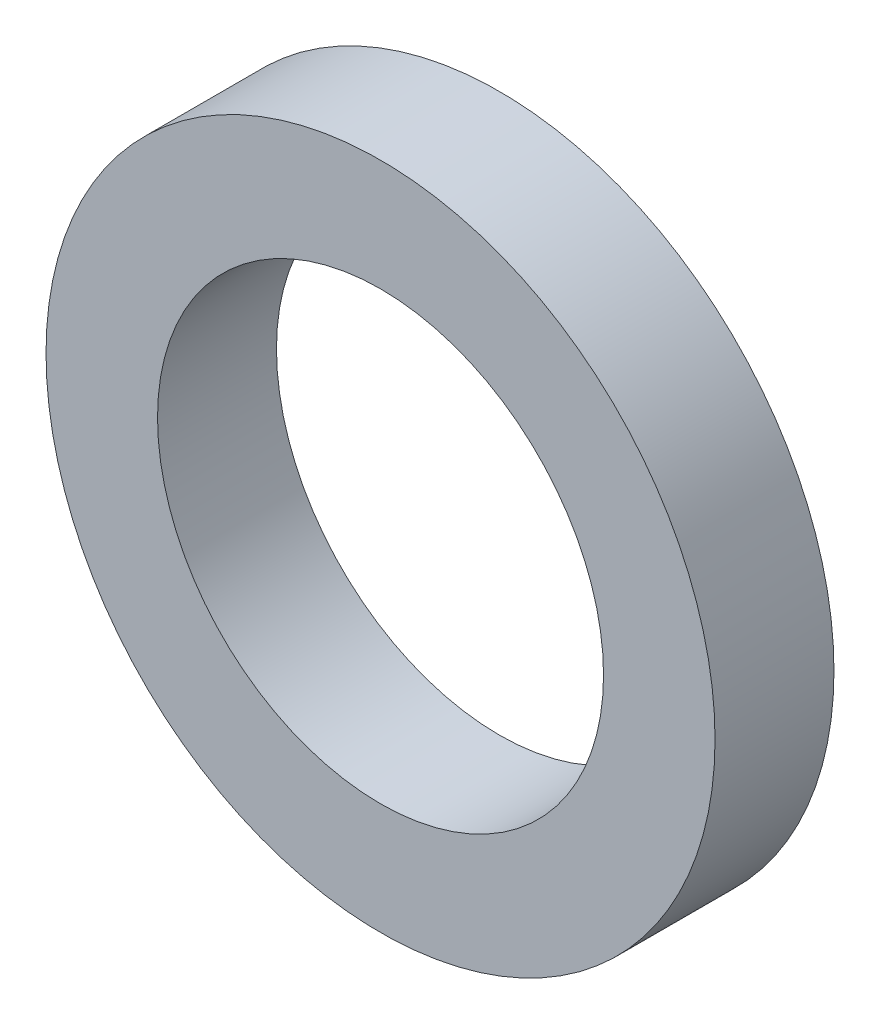
ISO-10303-21;
HEADER;
FILE_DESCRIPTION(('STEP AP214'),'2;1');
FILE_NAME('part.step','',(''),(''),'','','');
FILE_SCHEMA(('AUTOMOTIVE_DESIGN { 1 0 10303 214 1 1 1 1 }'));
ENDSEC;
DATA;
#1=APPLICATION_CONTEXT('core data for automotive mechanical design processes');
#2=APPLICATION_PROTOCOL_DEFINITION('international standard','automotive_design',2000,#1);
#3=PRODUCT_CONTEXT('',#1,'mechanical');
#4=PRODUCT('Part','Part','',(#3));
#5=PRODUCT_RELATED_PRODUCT_CATEGORY('part','',(#4));
#6=PRODUCT_DEFINITION_FORMATION('','',#4);
#7=PRODUCT_DEFINITION_CONTEXT('part definition',#1,'design');
#8=PRODUCT_DEFINITION('design','',#6,#7);
#9=PRODUCT_DEFINITION_SHAPE('','',#8);
#10=(LENGTH_UNIT() NAMED_UNIT(*) SI_UNIT(.MILLI.,.METRE.));
#11=(NAMED_UNIT(*) PLANE_ANGLE_UNIT() SI_UNIT($,.RADIAN.));
#12=(NAMED_UNIT(*) SI_UNIT($,.STERADIAN.) SOLID_ANGLE_UNIT());
#13=UNCERTAINTY_MEASURE_WITH_UNIT(LENGTH_MEASURE(1.E-05),#10,'distance_accuracy_value','');
#14=(GEOMETRIC_REPRESENTATION_CONTEXT(3) GLOBAL_UNCERTAINTY_ASSIGNED_CONTEXT((#13)) GLOBAL_UNIT_ASSIGNED_CONTEXT((#10,
#11,#12)) REPRESENTATION_CONTEXT('',''));
#15=CARTESIAN_POINT('',(0.,0.,0.));
#16=DIRECTION('',(0.,0.,1.));
#17=DIRECTION('',(1.,0.,0.));
#18=AXIS2_PLACEMENT_3D('',#15,#16,#17);
#19=CARTESIAN_POINT('',(0.,0.,3.2));
#20=DIRECTION('',(0.,0.,1.));
#21=DIRECTION('',(1.,0.,0.));
#22=AXIS2_PLACEMENT_3D('',#19,#20,#21);
#23=PLANE('',#22);
#24=CARTESIAN_POINT('',(0.,0.,3.2));
#25=DIRECTION('',(0.,0.,1.));
#26=DIRECTION('',(1.,0.,0.));
#27=AXIS2_PLACEMENT_3D('',#24,#25,#26);
#28=CIRCLE('',#27,9.);
#29=CARTESIAN_POINT('',(9.,0.,3.2));
#30=VERTEX_POINT('',#29);
#31=EDGE_CURVE('E10',#30,#30,#28,.T.);
#32=ORIENTED_EDGE('',*,*,#31,.T.);
#33=EDGE_LOOP('',(#32));
#34=FACE_BOUND('',#33,.T.);
#35=CARTESIAN_POINT('',(0.,0.,3.2));
#36=DIRECTION('',(0.,0.,1.));
#37=DIRECTION('',(1.,0.,0.));
#38=AXIS2_PLACEMENT_3D('',#35,#36,#37);
#39=CIRCLE('',#38,6.);
#40=CARTESIAN_POINT('',(6.,0.,3.2));
#41=VERTEX_POINT('',#40);
#42=EDGE_CURVE('E42',#41,#41,#39,.T.);
#43=ORIENTED_EDGE('',*,*,#42,.F.);
#44=EDGE_LOOP('',(#43));
#45=FACE_BOUND('',#44,.T.);
#46=ADVANCED_FACE('F31',(#34,#45),#23,.T.);
#47=CARTESIAN_POINT('',(0.,0.,0.));
#48=DIRECTION('',(0.,0.,1.));
#49=DIRECTION('',(1.,0.,0.));
#50=AXIS2_PLACEMENT_3D('',#47,#48,#49);
#51=PLANE('',#50);
#52=CARTESIAN_POINT('',(0.,0.,0.));
#53=DIRECTION('',(0.,0.,1.));
#54=DIRECTION('',(1.,0.,0.));
#55=AXIS2_PLACEMENT_3D('',#52,#53,#54);
#56=CIRCLE('',#55,9.);
#57=CARTESIAN_POINT('',(9.,0.,0.));
#58=VERTEX_POINT('',#57);
#59=EDGE_CURVE('E35',#58,#58,#56,.T.);
#60=ORIENTED_EDGE('',*,*,#59,.F.);
#61=EDGE_LOOP('',(#60));
#62=FACE_BOUND('',#61,.T.);
#63=CARTESIAN_POINT('',(0.,0.,0.));
#64=DIRECTION('',(0.,0.,1.));
#65=DIRECTION('',(1.,0.,0.));
#66=AXIS2_PLACEMENT_3D('',#63,#64,#65);
#67=CIRCLE('',#66,6.);
#68=CARTESIAN_POINT('',(6.,0.,0.));
#69=VERTEX_POINT('',#68);
#70=EDGE_CURVE('E44',#69,#69,#67,.T.);
#71=ORIENTED_EDGE('',*,*,#70,.T.);
#72=EDGE_LOOP('',(#71));
#73=FACE_BOUND('',#72,.T.);
#74=ADVANCED_FACE('F54',(#62,#73),#51,.F.);
#75=CARTESIAN_POINT('',(0.,0.,3.2));
#76=DIRECTION('',(0.,0.,-1.));
#77=DIRECTION('',(-1.,0.,0.));
#78=AXIS2_PLACEMENT_3D('',#75,#76,#77);
#79=CYLINDRICAL_SURFACE('',#78,9.);
#80=ORIENTED_EDGE('',*,*,#31,.F.);
#81=EDGE_LOOP('',(#80));
#82=FACE_BOUND('',#81,.T.);
#83=ORIENTED_EDGE('',*,*,#59,.T.);
#84=EDGE_LOOP('',(#83));
#85=FACE_BOUND('',#84,.T.);
#86=ADVANCED_FACE('F33',(#82,#85),#79,.T.);
#87=CARTESIAN_POINT('',(0.,0.,3.2));
#88=DIRECTION('',(0.,0.,-1.));
#89=DIRECTION('',(-1.,0.,0.));
#90=AXIS2_PLACEMENT_3D('',#87,#88,#89);
#91=CYLINDRICAL_SURFACE('',#90,6.);
#92=ORIENTED_EDGE('',*,*,#42,.T.);
#93=EDGE_LOOP('',(#92));
#94=FACE_BOUND('',#93,.T.);
#95=ORIENTED_EDGE('',*,*,#70,.F.);
#96=EDGE_LOOP('',(#95));
#97=FACE_BOUND('',#96,.T.);
#98=ADVANCED_FACE('F50',(#94,#97),#91,.F.);
#99=CLOSED_SHELL('',(#46,#74,#86,#98));
#100=MANIFOLD_SOLID_BREP('B2',#99);
#101=ADVANCED_BREP_SHAPE_REPRESENTATION('',(#18,#100),#14);
#102=SHAPE_DEFINITION_REPRESENTATION(#9,#101);
ENDSEC;
END-ISO-10303-21;
